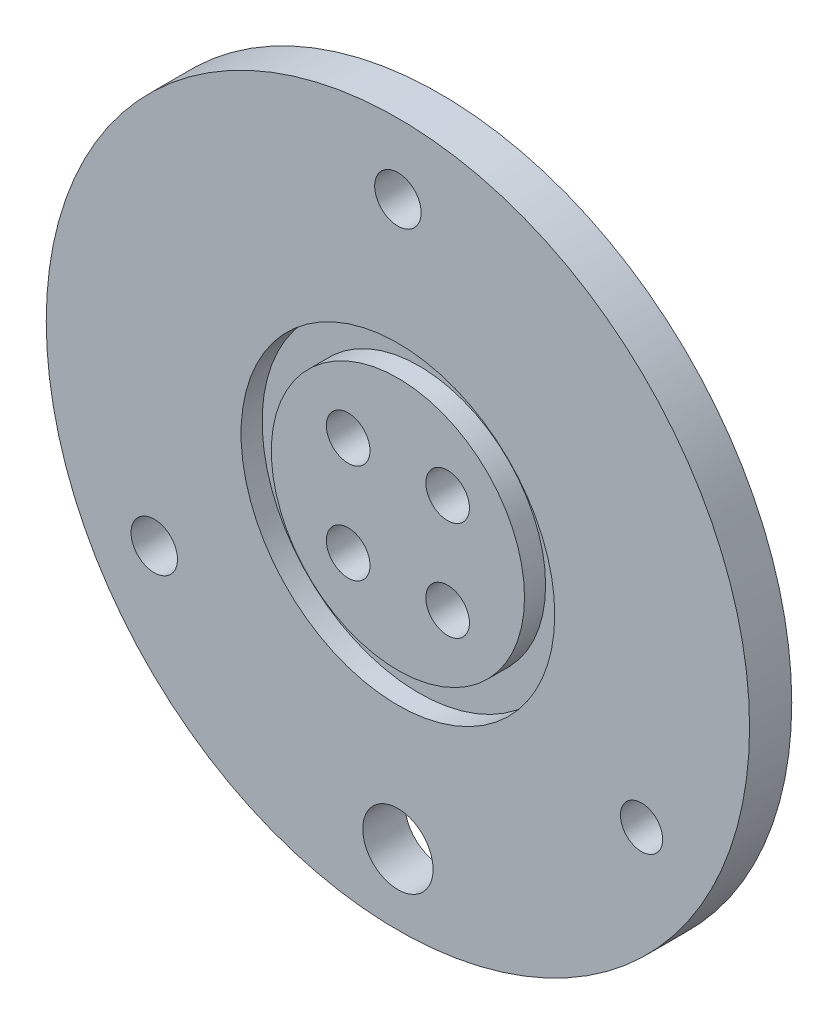
ISO-10303-21;
HEADER;
FILE_DESCRIPTION(('STEP AP214'),'2;1');
FILE_NAME('part.step','',(''),(''),'','','');
FILE_SCHEMA(('AUTOMOTIVE_DESIGN { 1 0 10303 214 1 1 1 1 }'));
ENDSEC;
DATA;
#1=APPLICATION_CONTEXT('core data for automotive mechanical design processes');
#2=APPLICATION_PROTOCOL_DEFINITION('international standard','automotive_design',2000,#1);
#3=PRODUCT_CONTEXT('',#1,'mechanical');
#4=PRODUCT('Part','Part','',(#3));
#5=PRODUCT_RELATED_PRODUCT_CATEGORY('part','',(#4));
#6=PRODUCT_DEFINITION_FORMATION('','',#4);
#7=PRODUCT_DEFINITION_CONTEXT('part definition',#1,'design');
#8=PRODUCT_DEFINITION('design','',#6,#7);
#9=PRODUCT_DEFINITION_SHAPE('','',#8);
#10=(LENGTH_UNIT() NAMED_UNIT(*) SI_UNIT(.MILLI.,.METRE.));
#11=(NAMED_UNIT(*) PLANE_ANGLE_UNIT() SI_UNIT($,.RADIAN.));
#12=(NAMED_UNIT(*) SI_UNIT($,.STERADIAN.) SOLID_ANGLE_UNIT());
#13=UNCERTAINTY_MEASURE_WITH_UNIT(LENGTH_MEASURE(1.E-05),#10,'distance_accuracy_value','');
#14=(GEOMETRIC_REPRESENTATION_CONTEXT(3) GLOBAL_UNCERTAINTY_ASSIGNED_CONTEXT((#13)) GLOBAL_UNIT_ASSIGNED_CONTEXT((#10,
#11,#12)) REPRESENTATION_CONTEXT('',''));
#15=CARTESIAN_POINT('',(0.,0.,0.));
#16=DIRECTION('',(0.,0.,1.));
#17=DIRECTION('',(1.,0.,0.));
#18=AXIS2_PLACEMENT_3D('',#15,#16,#17);
#19=CARTESIAN_POINT('',(17.32050807569,-10.,3.));
#20=DIRECTION('',(0.,0.,-1.));
#21=DIRECTION('',(-1.,0.,0.));
#22=AXIS2_PLACEMENT_3D('',#19,#20,#21);
#23=CYLINDRICAL_SURFACE('',#22,1.5);
#24=CARTESIAN_POINT('',(17.32050807569,-10.,3.));
#25=DIRECTION('',(0.,0.,1.));
#26=DIRECTION('',(1.,0.,0.));
#27=AXIS2_PLACEMENT_3D('',#24,#25,#26);
#28=CIRCLE('',#27,1.5);
#29=CARTESIAN_POINT('',(18.82050807569,-10.,3.));
#30=VERTEX_POINT('',#29);
#31=EDGE_CURVE('E47',#30,#30,#28,.T.);
#32=ORIENTED_EDGE('',*,*,#31,.T.);
#33=EDGE_LOOP('',(#32));
#34=FACE_BOUND('',#33,.T.);
#35=CARTESIAN_POINT('',(17.32050807569,-10.,0.));
#36=DIRECTION('',(0.,0.,1.));
#37=DIRECTION('',(1.,0.,0.));
#38=AXIS2_PLACEMENT_3D('',#35,#36,#37);
#39=CIRCLE('',#38,1.5);
#40=CARTESIAN_POINT('',(18.82050807569,-10.,0.));
#41=VERTEX_POINT('',#40);
#42=EDGE_CURVE('E65',#41,#41,#39,.T.);
#43=ORIENTED_EDGE('',*,*,#42,.F.);
#44=EDGE_LOOP('',(#43));
#45=FACE_BOUND('',#44,.T.);
#46=ADVANCED_FACE('F39',(#34,#45),#23,.F.);
#47=CARTESIAN_POINT('',(-17.32050807569,-10.,3.));
#48=DIRECTION('',(0.,0.,-1.));
#49=DIRECTION('',(-1.,0.,0.));
#50=AXIS2_PLACEMENT_3D('',#47,#48,#49);
#51=CYLINDRICAL_SURFACE('',#50,1.6500000000002);
#52=CARTESIAN_POINT('',(-17.32050807569,-10.,3.));
#53=DIRECTION('',(0.,0.,1.));
#54=DIRECTION('',(1.,0.,0.));
#55=AXIS2_PLACEMENT_3D('',#52,#53,#54);
#56=CIRCLE('',#55,1.6500000000002);
#57=CARTESIAN_POINT('',(-15.6705080756898,-10.,3.));
#58=VERTEX_POINT('',#57);
#59=EDGE_CURVE('E52',#58,#58,#56,.T.);
#60=ORIENTED_EDGE('',*,*,#59,.T.);
#61=EDGE_LOOP('',(#60));
#62=FACE_BOUND('',#61,.T.);
#63=CARTESIAN_POINT('',(-17.32050807569,-10.,0.));
#64=DIRECTION('',(0.,0.,1.));
#65=DIRECTION('',(1.,0.,0.));
#66=AXIS2_PLACEMENT_3D('',#63,#64,#65);
#67=CIRCLE('',#66,1.6500000000002);
#68=CARTESIAN_POINT('',(-15.6705080756898,-10.,0.));
#69=VERTEX_POINT('',#68);
#70=EDGE_CURVE('E63',#69,#69,#67,.T.);
#71=ORIENTED_EDGE('',*,*,#70,.F.);
#72=EDGE_LOOP('',(#71));
#73=FACE_BOUND('',#72,.T.);
#74=ADVANCED_FACE('F86',(#62,#73),#51,.F.);
#75=CARTESIAN_POINT('',(0.,20.0000000000021,3.));
#76=DIRECTION('',(0.,0.,-1.));
#77=DIRECTION('',(-1.,0.,0.));
#78=AXIS2_PLACEMENT_3D('',#75,#76,#77);
#79=CYLINDRICAL_SURFACE('',#78,1.64999999999924);
#80=CARTESIAN_POINT('',(0.,20.0000000000021,3.));
#81=DIRECTION('',(0.,0.,1.));
#82=DIRECTION('',(1.,0.,0.));
#83=AXIS2_PLACEMENT_3D('',#80,#81,#82);
#84=CIRCLE('',#83,1.64999999999924);
#85=CARTESIAN_POINT('',(1.64999999999924,20.0000000000021,3.));
#86=VERTEX_POINT('',#85);
#87=EDGE_CURVE('E74',#86,#86,#84,.T.);
#88=ORIENTED_EDGE('',*,*,#87,.T.);
#89=EDGE_LOOP('',(#88));
#90=FACE_BOUND('',#89,.T.);
#91=CARTESIAN_POINT('',(0.,20.0000000000021,0.));
#92=DIRECTION('',(0.,0.,1.));
#93=DIRECTION('',(1.,0.,0.));
#94=AXIS2_PLACEMENT_3D('',#91,#92,#93);
#95=CIRCLE('',#94,1.64999999999924);
#96=CARTESIAN_POINT('',(1.64999999999924,20.0000000000021,0.));
#97=VERTEX_POINT('',#96);
#98=EDGE_CURVE('E59',#97,#97,#95,.T.);
#99=ORIENTED_EDGE('',*,*,#98,.F.);
#100=EDGE_LOOP('',(#99));
#101=FACE_BOUND('',#100,.T.);
#102=ADVANCED_FACE('F105',(#90,#101),#79,.F.);
#103=CARTESIAN_POINT('',(0.,-20.,3.));
#104=DIRECTION('',(0.,0.,-1.));
#105=DIRECTION('',(-1.,0.,0.));
#106=AXIS2_PLACEMENT_3D('',#103,#104,#105);
#107=CYLINDRICAL_SURFACE('',#106,2.5);
#108=CARTESIAN_POINT('',(0.,-20.,3.));
#109=DIRECTION('',(0.,0.,1.));
#110=DIRECTION('',(1.,0.,0.));
#111=AXIS2_PLACEMENT_3D('',#108,#109,#110);
#112=CIRCLE('',#111,2.5);
#113=CARTESIAN_POINT('',(2.5,-20.,3.));
#114=VERTEX_POINT('',#113);
#115=EDGE_CURVE('E70',#114,#114,#112,.T.);
#116=ORIENTED_EDGE('',*,*,#115,.T.);
#117=EDGE_LOOP('',(#116));
#118=FACE_BOUND('',#117,.T.);
#119=CARTESIAN_POINT('',(0.,-20.,0.));
#120=DIRECTION('',(0.,0.,1.));
#121=DIRECTION('',(1.,0.,0.));
#122=AXIS2_PLACEMENT_3D('',#119,#120,#121);
#123=CIRCLE('',#122,2.5);
#124=CARTESIAN_POINT('',(2.5,-20.,0.));
#125=VERTEX_POINT('',#124);
#126=EDGE_CURVE('E56',#125,#125,#123,.T.);
#127=ORIENTED_EDGE('',*,*,#126,.F.);
#128=EDGE_LOOP('',(#127));
#129=FACE_BOUND('',#128,.T.);
#130=ADVANCED_FACE('F41',(#118,#129),#107,.F.);
#131=CARTESIAN_POINT('',(0.,0.,3.));
#132=DIRECTION('',(0.,0.,-1.));
#133=DIRECTION('',(-1.,0.,0.));
#134=AXIS2_PLACEMENT_3D('',#131,#132,#133);
#135=CYLINDRICAL_SURFACE('',#134,25.0000000000011);
#136=CARTESIAN_POINT('',(0.,0.,3.));
#137=DIRECTION('',(0.,0.,1.));
#138=DIRECTION('',(1.,0.,0.));
#139=AXIS2_PLACEMENT_3D('',#136,#137,#138);
#140=CIRCLE('',#139,25.0000000000011);
#141=CARTESIAN_POINT('',(25.0000000000011,0.,3.));
#142=VERTEX_POINT('',#141);
#143=EDGE_CURVE('E10',#142,#142,#140,.T.);
#144=ORIENTED_EDGE('',*,*,#143,.F.);
#145=EDGE_LOOP('',(#144));
#146=FACE_BOUND('',#145,.T.);
#147=CARTESIAN_POINT('',(0.,0.,0.));
#148=DIRECTION('',(0.,0.,1.));
#149=DIRECTION('',(1.,0.,0.));
#150=AXIS2_PLACEMENT_3D('',#147,#148,#149);
#151=CIRCLE('',#150,25.0000000000011);
#152=CARTESIAN_POINT('',(25.0000000000011,0.,0.));
#153=VERTEX_POINT('',#152);
#154=EDGE_CURVE('E43',#153,#153,#151,.T.);
#155=ORIENTED_EDGE('',*,*,#154,.T.);
#156=EDGE_LOOP('',(#155));
#157=FACE_BOUND('',#156,.T.);
#158=ADVANCED_FACE('F93',(#146,#157),#135,.T.);
#159=CARTESIAN_POINT('',(0.,0.,3.));
#160=DIRECTION('',(0.,0.,1.));
#161=DIRECTION('',(1.,0.,0.));
#162=AXIS2_PLACEMENT_3D('',#159,#160,#161);
#163=PLANE('',#162);
#164=CARTESIAN_POINT('',(0.,0.,3.));
#165=DIRECTION('',(0.,0.,1.));
#166=DIRECTION('',(1.,0.,0.));
#167=AXIS2_PLACEMENT_3D('',#164,#165,#166);
#168=CIRCLE('',#167,11.15);
#169=CARTESIAN_POINT('',(11.15,0.,3.));
#170=VERTEX_POINT('',#169);
#171=EDGE_CURVE('E81',#170,#170,#168,.T.);
#172=ORIENTED_EDGE('',*,*,#171,.F.);
#173=EDGE_LOOP('',(#172));
#174=FACE_BOUND('',#173,.T.);
#175=ORIENTED_EDGE('',*,*,#115,.F.);
#176=EDGE_LOOP('',(#175));
#177=FACE_BOUND('',#176,.T.);
#178=ORIENTED_EDGE('',*,*,#87,.F.);
#179=EDGE_LOOP('',(#178));
#180=FACE_BOUND('',#179,.T.);
#181=ORIENTED_EDGE('',*,*,#59,.F.);
#182=EDGE_LOOP('',(#181));
#183=FACE_BOUND('',#182,.T.);
#184=ORIENTED_EDGE('',*,*,#31,.F.);
#185=EDGE_LOOP('',(#184));
#186=FACE_BOUND('',#185,.T.);
#187=ORIENTED_EDGE('',*,*,#143,.T.);
#188=EDGE_LOOP('',(#187));
#189=FACE_BOUND('',#188,.T.);
#190=ADVANCED_FACE('F89',(#174,#177,#180,#183,#186,#189),#163,.T.);
#191=CARTESIAN_POINT('',(0.,0.,0.));
#192=DIRECTION('',(0.,0.,1.));
#193=DIRECTION('',(1.,0.,0.));
#194=AXIS2_PLACEMENT_3D('',#191,#192,#193);
#195=PLANE('',#194);
#196=CARTESIAN_POINT('',(-3.53553390593274,3.53553390593274,0.));
#197=DIRECTION('',(0.,0.,1.));
#198=DIRECTION('',(1.,0.,0.));
#199=AXIS2_PLACEMENT_3D('',#196,#197,#198);
#200=CIRCLE('',#199,1.55);
#201=CARTESIAN_POINT('',(-1.98553390593274,3.53553390593274,0.));
#202=VERTEX_POINT('',#201);
#203=EDGE_CURVE('E170',#202,#202,#200,.T.);
#204=ORIENTED_EDGE('',*,*,#203,.T.);
#205=EDGE_LOOP('',(#204));
#206=FACE_BOUND('',#205,.T.);
#207=CARTESIAN_POINT('',(3.53553390593274,-3.53553390593274,0.));
#208=DIRECTION('',(0.,0.,1.));
#209=DIRECTION('',(1.,0.,0.));
#210=AXIS2_PLACEMENT_3D('',#207,#208,#209);
#211=CIRCLE('',#210,1.55);
#212=CARTESIAN_POINT('',(5.08553390593274,-3.53553390593274,0.));
#213=VERTEX_POINT('',#212);
#214=EDGE_CURVE('E176',#213,#213,#211,.T.);
#215=ORIENTED_EDGE('',*,*,#214,.T.);
#216=EDGE_LOOP('',(#215));
#217=FACE_BOUND('',#216,.T.);
#218=CARTESIAN_POINT('',(-3.53553390593274,-3.53553390593274,0.));
#219=DIRECTION('',(0.,0.,1.));
#220=DIRECTION('',(1.,0.,0.));
#221=AXIS2_PLACEMENT_3D('',#218,#219,#220);
#222=CIRCLE('',#221,1.55);
#223=CARTESIAN_POINT('',(-1.98553390593274,-3.53553390593274,0.));
#224=VERTEX_POINT('',#223);
#225=EDGE_CURVE('E161',#224,#224,#222,.T.);
#226=ORIENTED_EDGE('',*,*,#225,.T.);
#227=EDGE_LOOP('',(#226));
#228=FACE_BOUND('',#227,.T.);
#229=CARTESIAN_POINT('',(3.53553390593274,3.53553390593274,0.));
#230=DIRECTION('',(0.,0.,1.));
#231=DIRECTION('',(1.,0.,0.));
#232=AXIS2_PLACEMENT_3D('',#229,#230,#231);
#233=CIRCLE('',#232,1.55);
#234=CARTESIAN_POINT('',(5.08553390593274,3.53553390593274,0.));
#235=VERTEX_POINT('',#234);
#236=EDGE_CURVE('E181',#235,#235,#233,.T.);
#237=ORIENTED_EDGE('',*,*,#236,.T.);
#238=EDGE_LOOP('',(#237));
#239=FACE_BOUND('',#238,.T.);
#240=ORIENTED_EDGE('',*,*,#126,.T.);
#241=EDGE_LOOP('',(#240));
#242=FACE_BOUND('',#241,.T.);
#243=ORIENTED_EDGE('',*,*,#98,.T.);
#244=EDGE_LOOP('',(#243));
#245=FACE_BOUND('',#244,.T.);
#246=ORIENTED_EDGE('',*,*,#70,.T.);
#247=EDGE_LOOP('',(#246));
#248=FACE_BOUND('',#247,.T.);
#249=ORIENTED_EDGE('',*,*,#42,.T.);
#250=EDGE_LOOP('',(#249));
#251=FACE_BOUND('',#250,.T.);
#252=ORIENTED_EDGE('',*,*,#154,.F.);
#253=EDGE_LOOP('',(#252));
#254=FACE_BOUND('',#253,.T.);
#255=ADVANCED_FACE('F92',(#206,#217,#228,#239,#242,#245,#248,#251,#254),#195,.F.);
#256=CARTESIAN_POINT('',(0.,0.,1.5));
#257=DIRECTION('',(0.,0.,1.));
#258=DIRECTION('',(1.,0.,0.));
#259=AXIS2_PLACEMENT_3D('',#256,#257,#258);
#260=CYLINDRICAL_SURFACE('',#259,11.15);
#261=CARTESIAN_POINT('',(0.,0.,1.5));
#262=DIRECTION('',(0.,0.,1.));
#263=DIRECTION('',(1.,0.,0.));
#264=AXIS2_PLACEMENT_3D('',#261,#262,#263);
#265=CIRCLE('',#264,11.15);
#266=CARTESIAN_POINT('',(11.15,0.,1.5));
#267=VERTEX_POINT('',#266);
#268=EDGE_CURVE('E60',#267,#267,#265,.T.);
#269=ORIENTED_EDGE('',*,*,#268,.F.);
#270=EDGE_LOOP('',(#269));
#271=FACE_BOUND('',#270,.T.);
#272=ORIENTED_EDGE('',*,*,#171,.T.);
#273=EDGE_LOOP('',(#272));
#274=FACE_BOUND('',#273,.T.);
#275=ADVANCED_FACE('F120',(#271,#274),#260,.F.);
#276=CARTESIAN_POINT('',(0.,0.,1.5));
#277=DIRECTION('',(0.,0.,1.));
#278=DIRECTION('',(1.,0.,0.));
#279=AXIS2_PLACEMENT_3D('',#276,#277,#278);
#280=PLANE('',#279);
#281=CARTESIAN_POINT('',(0.,0.,1.5));
#282=DIRECTION('',(0.,0.,1.));
#283=DIRECTION('',(1.,0.,0.));
#284=AXIS2_PLACEMENT_3D('',#281,#282,#283);
#285=CIRCLE('',#284,9.);
#286=CARTESIAN_POINT('',(9.,0.,1.5));
#287=VERTEX_POINT('',#286);
#288=EDGE_CURVE('E187',#287,#287,#285,.T.);
#289=ORIENTED_EDGE('',*,*,#288,.F.);
#290=EDGE_LOOP('',(#289));
#291=FACE_BOUND('',#290,.T.);
#292=ORIENTED_EDGE('',*,*,#268,.T.);
#293=EDGE_LOOP('',(#292));
#294=FACE_BOUND('',#293,.T.);
#295=ADVANCED_FACE('F129',(#291,#294),#280,.T.);
#296=CARTESIAN_POINT('',(0.,0.,1.5));
#297=DIRECTION('',(0.,0.,1.));
#298=DIRECTION('',(1.,0.,0.));
#299=AXIS2_PLACEMENT_3D('',#296,#297,#298);
#300=CYLINDRICAL_SURFACE('',#299,9.);
#301=ORIENTED_EDGE('',*,*,#288,.T.);
#302=EDGE_LOOP('',(#301));
#303=FACE_BOUND('',#302,.T.);
#304=CARTESIAN_POINT('',(0.,0.,3.));
#305=DIRECTION('',(0.,0.,1.));
#306=DIRECTION('',(1.,0.,0.));
#307=AXIS2_PLACEMENT_3D('',#304,#305,#306);
#308=CIRCLE('',#307,9.);
#309=CARTESIAN_POINT('',(9.,0.,3.));
#310=VERTEX_POINT('',#309);
#311=EDGE_CURVE('E184',#310,#310,#308,.T.);
#312=ORIENTED_EDGE('',*,*,#311,.F.);
#313=EDGE_LOOP('',(#312));
#314=FACE_BOUND('',#313,.T.);
#315=ADVANCED_FACE('F137',(#303,#314),#300,.T.);
#316=CARTESIAN_POINT('',(-3.53553390593274,3.53553390593274,3.));
#317=DIRECTION('',(0.,0.,1.));
#318=DIRECTION('',(1.,0.,0.));
#319=AXIS2_PLACEMENT_3D('',#316,#317,#318);
#320=CIRCLE('',#319,1.55);
#321=CARTESIAN_POINT('',(-1.98553390593274,3.53553390593274,3.));
#322=VERTEX_POINT('',#321);
#323=EDGE_CURVE('E173',#322,#322,#320,.T.);
#324=ORIENTED_EDGE('',*,*,#323,.F.);
#325=EDGE_LOOP('',(#324));
#326=FACE_BOUND('',#325,.T.);
#327=CARTESIAN_POINT('',(3.53553390593274,-3.53553390593274,3.));
#328=DIRECTION('',(0.,0.,1.));
#329=DIRECTION('',(1.,0.,0.));
#330=AXIS2_PLACEMENT_3D('',#327,#328,#329);
#331=CIRCLE('',#330,1.55);
#332=CARTESIAN_POINT('',(5.08553390593274,-3.53553390593274,3.));
#333=VERTEX_POINT('',#332);
#334=EDGE_CURVE('E167',#333,#333,#331,.T.);
#335=ORIENTED_EDGE('',*,*,#334,.F.);
#336=EDGE_LOOP('',(#335));
#337=FACE_BOUND('',#336,.T.);
#338=CARTESIAN_POINT('',(-3.53553390593274,-3.53553390593274,3.));
#339=DIRECTION('',(0.,0.,1.));
#340=DIRECTION('',(1.,0.,0.));
#341=AXIS2_PLACEMENT_3D('',#338,#339,#340);
#342=CIRCLE('',#341,1.55);
#343=CARTESIAN_POINT('',(-1.98553390593274,-3.53553390593274,3.));
#344=VERTEX_POINT('',#343);
#345=EDGE_CURVE('E164',#344,#344,#342,.T.);
#346=ORIENTED_EDGE('',*,*,#345,.F.);
#347=EDGE_LOOP('',(#346));
#348=FACE_BOUND('',#347,.T.);
#349=CARTESIAN_POINT('',(3.53553390593274,3.53553390593274,3.));
#350=DIRECTION('',(0.,0.,1.));
#351=DIRECTION('',(1.,0.,0.));
#352=AXIS2_PLACEMENT_3D('',#349,#350,#351);
#353=CIRCLE('',#352,1.55);
#354=CARTESIAN_POINT('',(5.08553390593274,3.53553390593274,3.));
#355=VERTEX_POINT('',#354);
#356=EDGE_CURVE('E172',#355,#355,#353,.T.);
#357=ORIENTED_EDGE('',*,*,#356,.F.);
#358=EDGE_LOOP('',(#357));
#359=FACE_BOUND('',#358,.T.);
#360=ORIENTED_EDGE('',*,*,#311,.T.);
#361=EDGE_LOOP('',(#360));
#362=FACE_BOUND('',#361,.T.);
#363=ADVANCED_FACE('F96',(#326,#337,#348,#359,#362),#163,.T.);
#364=CARTESIAN_POINT('',(3.53553390593274,3.53553390593274,0.));
#365=DIRECTION('',(0.,0.,1.));
#366=DIRECTION('',(1.,0.,0.));
#367=AXIS2_PLACEMENT_3D('',#364,#365,#366);
#368=CYLINDRICAL_SURFACE('',#367,1.55);
#369=ORIENTED_EDGE('',*,*,#236,.F.);
#370=EDGE_LOOP('',(#369));
#371=FACE_BOUND('',#370,.T.);
#372=ORIENTED_EDGE('',*,*,#356,.T.);
#373=EDGE_LOOP('',(#372));
#374=FACE_BOUND('',#373,.T.);
#375=ADVANCED_FACE('F141',(#371,#374),#368,.F.);
#376=CARTESIAN_POINT('',(-3.53553390593274,-3.53553390593274,0.));
#377=DIRECTION('',(0.,0.,1.));
#378=DIRECTION('',(1.,0.,0.));
#379=AXIS2_PLACEMENT_3D('',#376,#377,#378);
#380=CYLINDRICAL_SURFACE('',#379,1.55);
#381=ORIENTED_EDGE('',*,*,#225,.F.);
#382=EDGE_LOOP('',(#381));
#383=FACE_BOUND('',#382,.T.);
#384=ORIENTED_EDGE('',*,*,#345,.T.);
#385=EDGE_LOOP('',(#384));
#386=FACE_BOUND('',#385,.T.);
#387=ADVANCED_FACE('F144',(#383,#386),#380,.F.);
#388=CARTESIAN_POINT('',(3.53553390593274,-3.53553390593274,0.));
#389=DIRECTION('',(0.,0.,1.));
#390=DIRECTION('',(1.,0.,0.));
#391=AXIS2_PLACEMENT_3D('',#388,#389,#390);
#392=CYLINDRICAL_SURFACE('',#391,1.55);
#393=ORIENTED_EDGE('',*,*,#214,.F.);
#394=EDGE_LOOP('',(#393));
#395=FACE_BOUND('',#394,.T.);
#396=ORIENTED_EDGE('',*,*,#334,.T.);
#397=EDGE_LOOP('',(#396));
#398=FACE_BOUND('',#397,.T.);
#399=ADVANCED_FACE('F146',(#395,#398),#392,.F.);
#400=CARTESIAN_POINT('',(-3.53553390593274,3.53553390593274,0.));
#401=DIRECTION('',(0.,0.,1.));
#402=DIRECTION('',(1.,0.,0.));
#403=AXIS2_PLACEMENT_3D('',#400,#401,#402);
#404=CYLINDRICAL_SURFACE('',#403,1.55);
#405=ORIENTED_EDGE('',*,*,#203,.F.);
#406=EDGE_LOOP('',(#405));
#407=FACE_BOUND('',#406,.T.);
#408=ORIENTED_EDGE('',*,*,#323,.T.);
#409=EDGE_LOOP('',(#408));
#410=FACE_BOUND('',#409,.T.);
#411=ADVANCED_FACE('F149',(#407,#410),#404,.F.);
#412=CLOSED_SHELL('',(#46,#74,#102,#130,#158,#190,#255,#275,#295,#315,#363,#375,#387,#399,#411));
#413=MANIFOLD_SOLID_BREP('B2',#412);
#414=ADVANCED_BREP_SHAPE_REPRESENTATION('',(#18,#413),#14);
#415=SHAPE_DEFINITION_REPRESENTATION(#9,#414);
ENDSEC;
END-ISO-10303-21;
